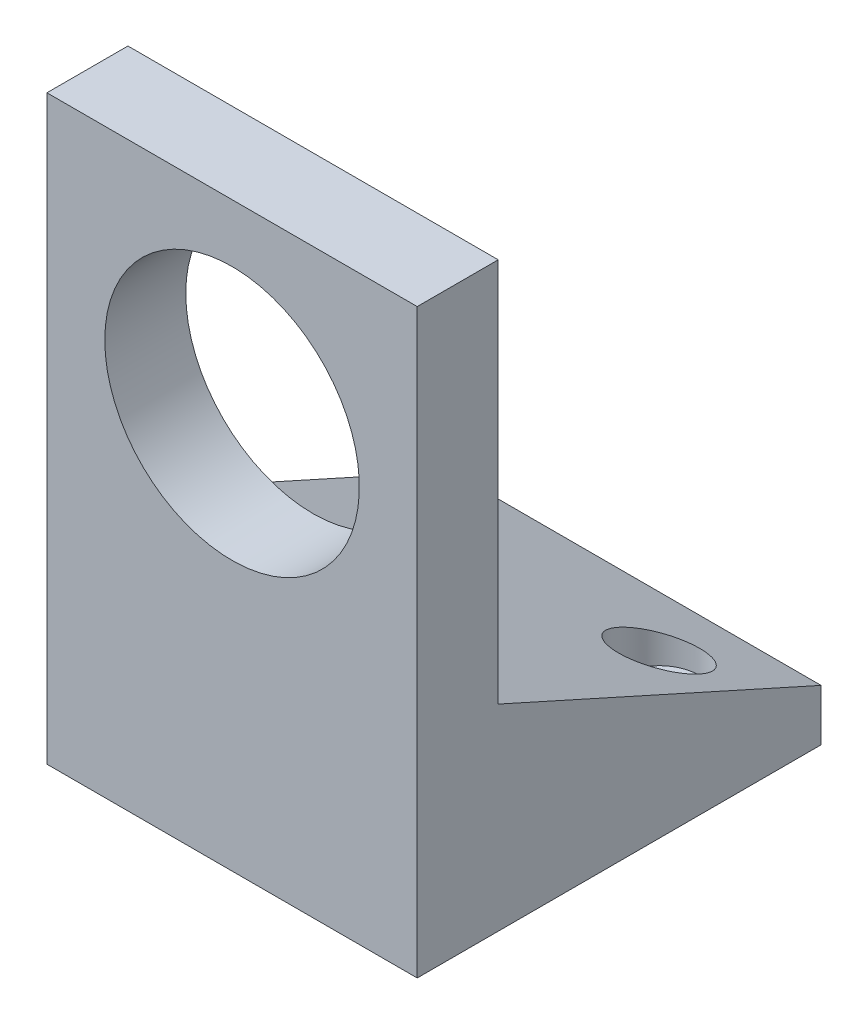
ISO-10303-21;
HEADER;
FILE_DESCRIPTION(('STEP AP214'),'2;1');
FILE_NAME('part.step','',(''),(''),'','','');
FILE_SCHEMA(('AUTOMOTIVE_DESIGN { 1 0 10303 214 1 1 1 1 }'));
ENDSEC;
DATA;
#1=APPLICATION_CONTEXT('core data for automotive mechanical design processes');
#2=APPLICATION_PROTOCOL_DEFINITION('international standard','automotive_design',2000,#1);
#3=PRODUCT_CONTEXT('',#1,'mechanical');
#4=PRODUCT('Part','Part','',(#3));
#5=PRODUCT_RELATED_PRODUCT_CATEGORY('part','',(#4));
#6=PRODUCT_DEFINITION_FORMATION('','',#4);
#7=PRODUCT_DEFINITION_CONTEXT('part definition',#1,'design');
#8=PRODUCT_DEFINITION('design','',#6,#7);
#9=PRODUCT_DEFINITION_SHAPE('','',#8);
#10=(LENGTH_UNIT() NAMED_UNIT(*) SI_UNIT(.MILLI.,.METRE.));
#11=(NAMED_UNIT(*) PLANE_ANGLE_UNIT() SI_UNIT($,.RADIAN.));
#12=(NAMED_UNIT(*) SI_UNIT($,.STERADIAN.) SOLID_ANGLE_UNIT());
#13=UNCERTAINTY_MEASURE_WITH_UNIT(LENGTH_MEASURE(1.E-05),#10,'distance_accuracy_value','');
#14=(GEOMETRIC_REPRESENTATION_CONTEXT(3) GLOBAL_UNCERTAINTY_ASSIGNED_CONTEXT((#13)) GLOBAL_UNIT_ASSIGNED_CONTEXT((#10,
#11,#12)) REPRESENTATION_CONTEXT('',''));
#15=CARTESIAN_POINT('',(0.,0.,0.));
#16=DIRECTION('',(0.,0.,1.));
#17=DIRECTION('',(1.,0.,0.));
#18=AXIS2_PLACEMENT_3D('',#15,#16,#17);
#19=CARTESIAN_POINT('',(70.,72.0000000000001,4.8));
#20=DIRECTION('',(0.,0.,-1.));
#21=DIRECTION('',(-1.,0.,0.));
#22=AXIS2_PLACEMENT_3D('',#19,#20,#21);
#23=CYLINDRICAL_SURFACE('',#22,11.);
#24=CARTESIAN_POINT('',(70.,72.0000000000001,4.9));
#25=DIRECTION('',(0.,0.,-1.));
#26=DIRECTION('',(-1.,0.,0.));
#27=AXIS2_PLACEMENT_3D('',#24,#25,#26);
#28=CIRCLE('',#27,11.);
#29=CARTESIAN_POINT('',(59.,72.0000000000001,4.9));
#30=VERTEX_POINT('',#29);
#31=EDGE_CURVE('E49',#30,#30,#28,.T.);
#32=ORIENTED_EDGE('',*,*,#31,.F.);
#33=EDGE_LOOP('',(#32));
#34=FACE_BOUND('',#33,.T.);
#35=CARTESIAN_POINT('',(70.,72.0000000000001,-2.1));
#36=DIRECTION('',(0.,0.,-1.));
#37=DIRECTION('',(0.,1.,0.));
#38=AXIS2_PLACEMENT_3D('',#35,#36,#37);
#39=CIRCLE('',#38,11.);
#40=CARTESIAN_POINT('',(70.,83.,-2.1));
#41=VERTEX_POINT('',#40);
#42=EDGE_CURVE('E144',#41,#41,#39,.T.);
#43=ORIENTED_EDGE('',*,*,#42,.T.);
#44=EDGE_LOOP('',(#43));
#45=FACE_BOUND('',#44,.T.);
#46=ADVANCED_FACE('F41',(#34,#45),#23,.F.);
#47=CARTESIAN_POINT('',(54.,0.,100.));
#48=DIRECTION('',(1.,0.,0.));
#49=DIRECTION('',(0.,1.,0.));
#50=AXIS2_PLACEMENT_3D('',#47,#48,#49);
#51=PLANE('',#50);
#52=DIRECTION('',(0.,1.,0.));
#53=VECTOR('',#52,1.);
#54=CARTESIAN_POINT('',(54.,41.8,-30.));
#55=LINE('',#54,#53);
#56=CARTESIAN_POINT('',(54.,37.75,-30.));
#57=VERTEX_POINT('',#56);
#58=CARTESIAN_POINT('',(54.,42.2,-30.));
#59=VERTEX_POINT('',#58);
#60=EDGE_CURVE('E114',#57,#59,#55,.T.);
#61=ORIENTED_EDGE('',*,*,#60,.F.);
#62=DIRECTION('',(0.,0.,1.));
#63=VECTOR('',#62,1.);
#64=CARTESIAN_POINT('',(54.,37.75,-105.1));
#65=LINE('',#64,#63);
#66=CARTESIAN_POINT('',(54.,37.75,4.9));
#67=VERTEX_POINT('',#66);
#68=EDGE_CURVE('E57',#57,#67,#65,.T.);
#69=ORIENTED_EDGE('',*,*,#68,.T.);
#70=DIRECTION('',(0.,1.,0.));
#71=VECTOR('',#70,1.);
#72=CARTESIAN_POINT('',(54.,0.,4.9));
#73=LINE('',#72,#71);
#74=CARTESIAN_POINT('',(54.,88.0000000000001,4.9));
#75=VERTEX_POINT('',#74);
#76=EDGE_CURVE('E108',#67,#75,#73,.T.);
#77=ORIENTED_EDGE('',*,*,#76,.T.);
#78=DIRECTION('',(0.,0.,-1.));
#79=VECTOR('',#78,1.);
#80=CARTESIAN_POINT('',(54.,88.0000000000001,10.));
#81=LINE('',#80,#79);
#82=CARTESIAN_POINT('',(54.,88.0000000000001,-2.1));
#83=VERTEX_POINT('',#82);
#84=EDGE_CURVE('E154',#75,#83,#81,.T.);
#85=ORIENTED_EDGE('',*,*,#84,.T.);
#86=DIRECTION('',(0.,1.,0.));
#87=VECTOR('',#86,1.);
#88=CARTESIAN_POINT('',(54.,88.0000000000001,-2.1));
#89=LINE('',#88,#87);
#90=CARTESIAN_POINT('',(54.,54.7499199490744,-2.1));
#91=VERTEX_POINT('',#90);
#92=EDGE_CURVE('E149',#91,#83,#89,.T.);
#93=ORIENTED_EDGE('',*,*,#92,.F.);
#94=DIRECTION('',(0.,-0.410226581481188,-0.91198363573381));
#95=VECTOR('',#94,1.);
#96=CARTESIAN_POINT('',(54.,54.7499199490744,-2.1));
#97=LINE('',#96,#95);
#98=EDGE_CURVE('E137',#91,#59,#97,.T.);
#99=ORIENTED_EDGE('',*,*,#98,.T.);
#100=EDGE_LOOP('',(#61,#69,#77,#85,#93,#99));
#101=FACE_BOUND('',#100,.T.);
#102=ADVANCED_FACE('F203',(#101),#51,.F.);
#103=CARTESIAN_POINT('',(86.,102.7,100.));
#104=DIRECTION('',(-1.,0.,0.));
#105=DIRECTION('',(0.,-1.,0.));
#106=AXIS2_PLACEMENT_3D('',#103,#104,#105);
#107=PLANE('',#106);
#108=DIRECTION('',(0.,1.,0.));
#109=VECTOR('',#108,1.);
#110=CARTESIAN_POINT('',(86.,92.7631774285374,4.9));
#111=LINE('',#110,#109);
#112=CARTESIAN_POINT('',(86.,37.75,4.9));
#113=VERTEX_POINT('',#112);
#114=CARTESIAN_POINT('',(86.,88.0000000000001,4.9));
#115=VERTEX_POINT('',#114);
#116=EDGE_CURVE('E106',#113,#115,#111,.T.);
#117=ORIENTED_EDGE('',*,*,#116,.F.);
#118=DIRECTION('',(0.,0.,1.));
#119=VECTOR('',#118,1.);
#120=CARTESIAN_POINT('',(86.,37.75,-105.1));
#121=LINE('',#120,#119);
#122=CARTESIAN_POINT('',(86.,37.75,-30.));
#123=VERTEX_POINT('',#122);
#124=EDGE_CURVE('E93',#123,#113,#121,.T.);
#125=ORIENTED_EDGE('',*,*,#124,.F.);
#126=DIRECTION('',(0.,-1.,0.));
#127=VECTOR('',#126,1.);
#128=CARTESIAN_POINT('',(86.,41.8,-30.));
#129=LINE('',#128,#127);
#130=CARTESIAN_POINT('',(86.,42.2,-30.));
#131=VERTEX_POINT('',#130);
#132=EDGE_CURVE('E117',#131,#123,#129,.T.);
#133=ORIENTED_EDGE('',*,*,#132,.F.);
#134=DIRECTION('',(0.,-0.410226581481188,-0.91198363573381));
#135=VECTOR('',#134,1.);
#136=CARTESIAN_POINT('',(86.,54.7499199490744,-2.1));
#137=LINE('',#136,#135);
#138=CARTESIAN_POINT('',(86.,54.7499199490744,-2.1));
#139=VERTEX_POINT('',#138);
#140=EDGE_CURVE('E162',#139,#131,#137,.T.);
#141=ORIENTED_EDGE('',*,*,#140,.F.);
#142=DIRECTION('',(0.,-1.,0.));
#143=VECTOR('',#142,1.);
#144=CARTESIAN_POINT('',(86.,88.0000000000001,-2.1));
#145=LINE('',#144,#143);
#146=CARTESIAN_POINT('',(86.,88.0000000000001,-2.1));
#147=VERTEX_POINT('',#146);
#148=EDGE_CURVE('E147',#147,#139,#145,.T.);
#149=ORIENTED_EDGE('',*,*,#148,.F.);
#150=DIRECTION('',(0.,0.,-1.));
#151=VECTOR('',#150,1.);
#152=CARTESIAN_POINT('',(86.,88.0000000000001,10.));
#153=LINE('',#152,#151);
#154=EDGE_CURVE('E113',#115,#147,#153,.T.);
#155=ORIENTED_EDGE('',*,*,#154,.F.);
#156=EDGE_LOOP('',(#117,#125,#133,#141,#149,#155));
#157=FACE_BOUND('',#156,.T.);
#158=ADVANCED_FACE('F111',(#157),#107,.F.);
#159=CARTESIAN_POINT('',(-14.,92.7631774285374,4.9));
#160=DIRECTION('',(0.,0.,-1.));
#161=DIRECTION('',(-1.,0.,0.));
#162=AXIS2_PLACEMENT_3D('',#159,#160,#161);
#163=PLANE('',#162);
#164=ORIENTED_EDGE('',*,*,#31,.T.);
#165=EDGE_LOOP('',(#164));
#166=FACE_BOUND('',#165,.T.);
#167=ORIENTED_EDGE('',*,*,#76,.F.);
#168=DIRECTION('',(-1.,0.,0.));
#169=VECTOR('',#168,1.);
#170=CARTESIAN_POINT('',(54.,37.75,4.9));
#171=LINE('',#170,#169);
#172=EDGE_CURVE('E96',#113,#67,#171,.T.);
#173=ORIENTED_EDGE('',*,*,#172,.F.);
#174=ORIENTED_EDGE('',*,*,#116,.T.);
#175=DIRECTION('',(-1.,0.,0.));
#176=VECTOR('',#175,1.);
#177=CARTESIAN_POINT('',(-14.,88.0000000000001,4.9));
#178=LINE('',#177,#176);
#179=EDGE_CURVE('E11',#115,#75,#178,.T.);
#180=ORIENTED_EDGE('',*,*,#179,.T.);
#181=EDGE_LOOP('',(#167,#173,#174,#180));
#182=FACE_BOUND('',#181,.T.);
#183=ADVANCED_FACE('F105',(#166,#182),#163,.F.);
#184=CARTESIAN_POINT('',(0.,0.,-30.));
#185=DIRECTION('',(0.,0.,1.));
#186=DIRECTION('',(0.,-1.,0.));
#187=AXIS2_PLACEMENT_3D('',#184,#185,#186);
#188=PLANE('',#187);
#189=ORIENTED_EDGE('',*,*,#132,.T.);
#190=DIRECTION('',(-1.,0.,0.));
#191=VECTOR('',#190,1.);
#192=CARTESIAN_POINT('',(0.,37.75,-30.));
#193=LINE('',#192,#191);
#194=EDGE_CURVE('E97',#123,#57,#193,.T.);
#195=ORIENTED_EDGE('',*,*,#194,.T.);
#196=ORIENTED_EDGE('',*,*,#60,.T.);
#197=DIRECTION('',(-1.,0.,0.));
#198=VECTOR('',#197,1.);
#199=CARTESIAN_POINT('',(90.6,42.2,-30.));
#200=LINE('',#199,#198);
#201=EDGE_CURVE('E141',#131,#59,#200,.T.);
#202=ORIENTED_EDGE('',*,*,#201,.F.);
#203=EDGE_LOOP('',(#189,#195,#196,#202));
#204=FACE_BOUND('',#203,.T.);
#205=ADVANCED_FACE('F158',(#204),#188,.F.);
#206=CARTESIAN_POINT('',(60.,33.8,-22.));
#207=DIRECTION('',(0.,1.,0.));
#208=DIRECTION('',(0.,0.,1.));
#209=AXIS2_PLACEMENT_3D('',#206,#207,#208);
#210=CYLINDRICAL_SURFACE('',#209,2.);
#211=CARTESIAN_POINT('',(60.,37.75,-22.));
#212=DIRECTION('',(0.,1.,0.));
#213=DIRECTION('',(0.,0.,1.));
#214=AXIS2_PLACEMENT_3D('',#211,#212,#213);
#215=CIRCLE('',#214,2.);
#216=CARTESIAN_POINT('',(60.,37.75,-20.));
#217=VERTEX_POINT('',#216);
#218=EDGE_CURVE('E176',#217,#217,#215,.F.);
#219=ORIENTED_EDGE('',*,*,#218,.T.);
#220=EDGE_LOOP('',(#219));
#221=FACE_BOUND('',#220,.T.);
#222=CARTESIAN_POINT('',(60.,42.2,-22.));
#223=DIRECTION('',(0.,-1.,0.));
#224=DIRECTION('',(1.,0.,0.));
#225=AXIS2_PLACEMENT_3D('',#222,#223,#224);
#226=CIRCLE('',#225,2.);
#227=CARTESIAN_POINT('',(62.,42.2,-22.));
#228=VERTEX_POINT('',#227);
#229=EDGE_CURVE('E128',#228,#228,#226,.F.);
#230=ORIENTED_EDGE('',*,*,#229,.T.);
#231=EDGE_LOOP('',(#230));
#232=FACE_BOUND('',#231,.T.);
#233=ADVANCED_FACE('F192',(#221,#232),#210,.F.);
#234=CARTESIAN_POINT('',(80.,33.8,-22.));
#235=DIRECTION('',(0.,1.,0.));
#236=DIRECTION('',(0.,0.,1.));
#237=AXIS2_PLACEMENT_3D('',#234,#235,#236);
#238=CYLINDRICAL_SURFACE('',#237,2.);
#239=CARTESIAN_POINT('',(80.,37.75,-22.));
#240=DIRECTION('',(0.,1.,0.));
#241=DIRECTION('',(0.,0.,1.));
#242=AXIS2_PLACEMENT_3D('',#239,#240,#241);
#243=CIRCLE('',#242,2.);
#244=CARTESIAN_POINT('',(80.,37.75,-20.));
#245=VERTEX_POINT('',#244);
#246=EDGE_CURVE('E44',#245,#245,#243,.F.);
#247=ORIENTED_EDGE('',*,*,#246,.T.);
#248=EDGE_LOOP('',(#247));
#249=FACE_BOUND('',#248,.T.);
#250=CARTESIAN_POINT('',(80.,42.2,-22.));
#251=DIRECTION('',(0.,-1.,0.));
#252=DIRECTION('',(1.,0.,0.));
#253=AXIS2_PLACEMENT_3D('',#250,#251,#252);
#254=CIRCLE('',#253,2.);
#255=CARTESIAN_POINT('',(82.,42.2,-22.));
#256=VERTEX_POINT('',#255);
#257=EDGE_CURVE('E132',#256,#256,#254,.F.);
#258=ORIENTED_EDGE('',*,*,#257,.T.);
#259=EDGE_LOOP('',(#258));
#260=FACE_BOUND('',#259,.T.);
#261=ADVANCED_FACE('F183',(#249,#260),#238,.F.);
#262=CARTESIAN_POINT('',(86.,88.0000000000001,10.));
#263=DIRECTION('',(0.,-1.,0.));
#264=DIRECTION('',(0.,0.,-1.));
#265=AXIS2_PLACEMENT_3D('',#262,#263,#264);
#266=PLANE('',#265);
#267=ORIENTED_EDGE('',*,*,#154,.T.);
#268=DIRECTION('',(1.,0.,0.));
#269=VECTOR('',#268,1.);
#270=CARTESIAN_POINT('',(86.,88.0000000000001,-2.1));
#271=LINE('',#270,#269);
#272=EDGE_CURVE('E151',#83,#147,#271,.T.);
#273=ORIENTED_EDGE('',*,*,#272,.F.);
#274=ORIENTED_EDGE('',*,*,#84,.F.);
#275=ORIENTED_EDGE('',*,*,#179,.F.);
#276=EDGE_LOOP('',(#267,#273,#274,#275));
#277=FACE_BOUND('',#276,.T.);
#278=ADVANCED_FACE('F199',(#277),#266,.F.);
#279=CARTESIAN_POINT('',(0.,0.,-2.1));
#280=DIRECTION('',(0.,0.,-1.));
#281=DIRECTION('',(0.,1.,0.));
#282=AXIS2_PLACEMENT_3D('',#279,#280,#281);
#283=PLANE('',#282);
#284=DIRECTION('',(-1.,0.,0.));
#285=VECTOR('',#284,1.);
#286=CARTESIAN_POINT('',(86.,54.7499199490744,-2.1));
#287=LINE('',#286,#285);
#288=EDGE_CURVE('E65',#139,#91,#287,.T.);
#289=ORIENTED_EDGE('',*,*,#288,.T.);
#290=ORIENTED_EDGE('',*,*,#92,.T.);
#291=ORIENTED_EDGE('',*,*,#272,.T.);
#292=ORIENTED_EDGE('',*,*,#148,.T.);
#293=EDGE_LOOP('',(#289,#290,#291,#292));
#294=FACE_BOUND('',#293,.T.);
#295=ORIENTED_EDGE('',*,*,#42,.F.);
#296=EDGE_LOOP('',(#295));
#297=FACE_BOUND('',#296,.T.);
#298=ADVANCED_FACE('F213',(#294,#297),#283,.T.);
#299=CARTESIAN_POINT('',(86.,54.7499199490744,-2.1));
#300=DIRECTION('',(0.,0.91198363573381,-0.410226581481188));
#301=DIRECTION('',(0.,0.410226581481188,0.91198363573381));
#302=AXIS2_PLACEMENT_3D('',#299,#300,#301);
#303=PLANE('',#302);
#304=CARTESIAN_POINT('',(80.,45.7985433545733,-22.));
#305=DIRECTION('',(0.,0.91198363573381,-0.410226581481188));
#306=DIRECTION('',(0.,-0.410226581481188,-0.91198363573381));
#307=AXIS2_PLACEMENT_3D('',#304,#305,#306);
#308=ELLIPSE('',#307,3.83778816073142,3.50000000000001);
#309=CARTESIAN_POINT('',(80.,44.2241806369475,-25.5));
#310=VERTEX_POINT('',#309);
#311=EDGE_CURVE('E125',#310,#310,#308,.T.);
#312=ORIENTED_EDGE('',*,*,#311,.F.);
#313=EDGE_LOOP('',(#312));
#314=FACE_BOUND('',#313,.T.);
#315=CARTESIAN_POINT('',(60.,45.7985433545733,-22.));
#316=DIRECTION('',(0.,0.91198363573381,-0.410226581481188));
#317=DIRECTION('',(0.,-0.410226581481188,-0.91198363573381));
#318=AXIS2_PLACEMENT_3D('',#315,#316,#317);
#319=ELLIPSE('',#318,3.8377881607314,3.49999999999999);
#320=CARTESIAN_POINT('',(60.,44.2241806369475,-25.5));
#321=VERTEX_POINT('',#320);
#322=EDGE_CURVE('E123',#321,#321,#319,.T.);
#323=ORIENTED_EDGE('',*,*,#322,.F.);
#324=EDGE_LOOP('',(#323));
#325=FACE_BOUND('',#324,.T.);
#326=ORIENTED_EDGE('',*,*,#98,.F.);
#327=ORIENTED_EDGE('',*,*,#288,.F.);
#328=ORIENTED_EDGE('',*,*,#140,.T.);
#329=ORIENTED_EDGE('',*,*,#201,.T.);
#330=EDGE_LOOP('',(#326,#327,#328,#329));
#331=FACE_BOUND('',#330,.T.);
#332=ADVANCED_FACE('F165',(#314,#325,#331),#303,.T.);
#333=CARTESIAN_POINT('',(60.,42.2,-22.));
#334=DIRECTION('',(0.,-1.,0.));
#335=DIRECTION('',(1.,0.,0.));
#336=AXIS2_PLACEMENT_3D('',#333,#334,#335);
#337=PLANE('',#336);
#338=CARTESIAN_POINT('',(60.,42.2,-22.));
#339=DIRECTION('',(0.,-1.,0.));
#340=DIRECTION('',(1.,0.,0.));
#341=AXIS2_PLACEMENT_3D('',#338,#339,#340);
#342=CIRCLE('',#341,3.49999999999999);
#343=CARTESIAN_POINT('',(63.5,42.2,-22.));
#344=VERTEX_POINT('',#343);
#345=EDGE_CURVE('E170',#344,#344,#342,.T.);
#346=ORIENTED_EDGE('',*,*,#345,.F.);
#347=EDGE_LOOP('',(#346));
#348=FACE_BOUND('',#347,.T.);
#349=ORIENTED_EDGE('',*,*,#229,.F.);
#350=EDGE_LOOP('',(#349));
#351=FACE_BOUND('',#350,.T.);
#352=ADVANCED_FACE('F220',(#348,#351),#337,.F.);
#353=CARTESIAN_POINT('',(60.,78.8,-22.));
#354=DIRECTION('',(0.,-1.,0.));
#355=DIRECTION('',(1.,0.,0.));
#356=AXIS2_PLACEMENT_3D('',#353,#354,#355);
#357=CYLINDRICAL_SURFACE('',#356,3.49999999999999);
#358=ORIENTED_EDGE('',*,*,#322,.T.);
#359=EDGE_LOOP('',(#358));
#360=FACE_BOUND('',#359,.T.);
#361=ORIENTED_EDGE('',*,*,#345,.T.);
#362=EDGE_LOOP('',(#361));
#363=FACE_BOUND('',#362,.T.);
#364=ADVANCED_FACE('F226',(#360,#363),#357,.F.);
#365=CARTESIAN_POINT('',(80.,42.2,-22.));
#366=DIRECTION('',(0.,-1.,0.));
#367=DIRECTION('',(1.,0.,0.));
#368=AXIS2_PLACEMENT_3D('',#365,#366,#367);
#369=PLANE('',#368);
#370=CARTESIAN_POINT('',(80.,42.2,-22.));
#371=DIRECTION('',(0.,-1.,0.));
#372=DIRECTION('',(1.,0.,0.));
#373=AXIS2_PLACEMENT_3D('',#370,#371,#372);
#374=CIRCLE('',#373,3.50000000000001);
#375=CARTESIAN_POINT('',(83.5,42.2,-22.));
#376=VERTEX_POINT('',#375);
#377=EDGE_CURVE('E126',#376,#376,#374,.T.);
#378=ORIENTED_EDGE('',*,*,#377,.F.);
#379=EDGE_LOOP('',(#378));
#380=FACE_BOUND('',#379,.T.);
#381=ORIENTED_EDGE('',*,*,#257,.F.);
#382=EDGE_LOOP('',(#381));
#383=FACE_BOUND('',#382,.T.);
#384=ADVANCED_FACE('F229',(#380,#383),#369,.F.);
#385=CARTESIAN_POINT('',(80.,78.8,-22.));
#386=DIRECTION('',(0.,-1.,0.));
#387=DIRECTION('',(1.,0.,0.));
#388=AXIS2_PLACEMENT_3D('',#385,#386,#387);
#389=CYLINDRICAL_SURFACE('',#388,3.50000000000001);
#390=ORIENTED_EDGE('',*,*,#311,.T.);
#391=EDGE_LOOP('',(#390));
#392=FACE_BOUND('',#391,.T.);
#393=ORIENTED_EDGE('',*,*,#377,.T.);
#394=EDGE_LOOP('',(#393));
#395=FACE_BOUND('',#394,.T.);
#396=ADVANCED_FACE('F188',(#392,#395),#389,.F.);
#397=CARTESIAN_POINT('',(54.,37.75,-105.1));
#398=DIRECTION('',(0.,1.,0.));
#399=DIRECTION('',(0.,0.,1.));
#400=AXIS2_PLACEMENT_3D('',#397,#398,#399);
#401=PLANE('',#400);
#402=ORIENTED_EDGE('',*,*,#246,.F.);
#403=EDGE_LOOP('',(#402));
#404=FACE_BOUND('',#403,.T.);
#405=ORIENTED_EDGE('',*,*,#218,.F.);
#406=EDGE_LOOP('',(#405));
#407=FACE_BOUND('',#406,.T.);
#408=ORIENTED_EDGE('',*,*,#124,.T.);
#409=ORIENTED_EDGE('',*,*,#172,.T.);
#410=ORIENTED_EDGE('',*,*,#68,.F.);
#411=ORIENTED_EDGE('',*,*,#194,.F.);
#412=EDGE_LOOP('',(#408,#409,#410,#411));
#413=FACE_BOUND('',#412,.T.);
#414=ADVANCED_FACE('F95',(#404,#407,#413),#401,.F.);
#415=CLOSED_SHELL('',(#46,#102,#158,#183,#205,#233,#261,#278,#298,#332,#352,#364,#384,#396,#414));
#416=MANIFOLD_SOLID_BREP('B2',#415);
#417=ADVANCED_BREP_SHAPE_REPRESENTATION('',(#18,#416),#14);
#418=SHAPE_DEFINITION_REPRESENTATION(#9,#417);
ENDSEC;
END-ISO-10303-21;
